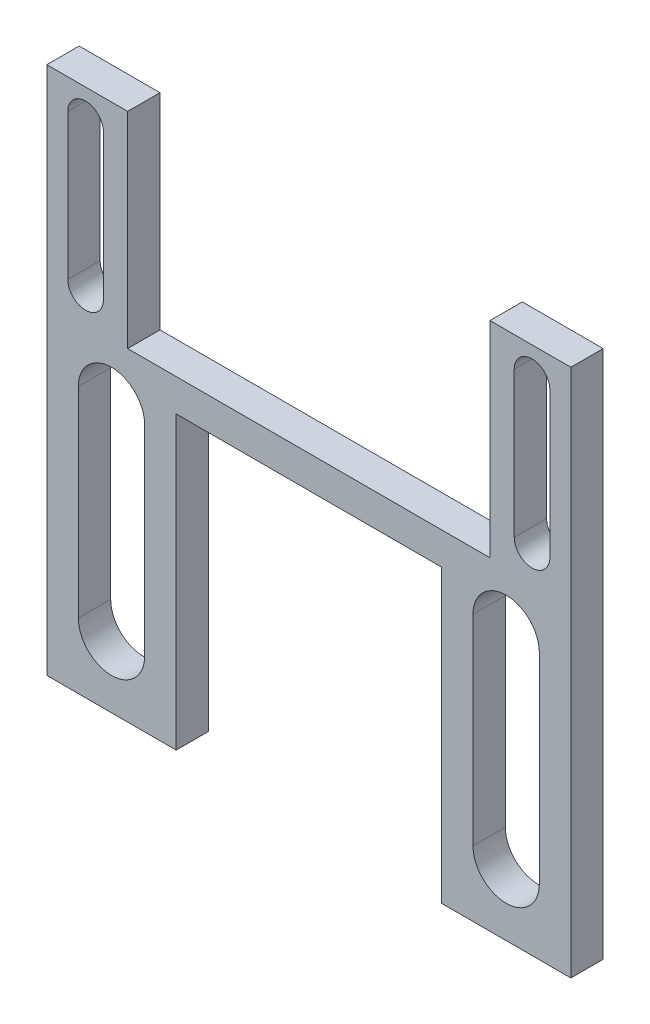
ISO-10303-21;
HEADER;
FILE_DESCRIPTION(('STEP AP214'),'2;1');
FILE_NAME('part.step','',(''),(''),'','','');
FILE_SCHEMA(('AUTOMOTIVE_DESIGN { 1 0 10303 214 1 1 1 1 }'));
ENDSEC;
DATA;
#1=APPLICATION_CONTEXT('core data for automotive mechanical design processes');
#2=APPLICATION_PROTOCOL_DEFINITION('international standard','automotive_design',2000,#1);
#3=PRODUCT_CONTEXT('',#1,'mechanical');
#4=PRODUCT('Part','Part','',(#3));
#5=PRODUCT_RELATED_PRODUCT_CATEGORY('part','',(#4));
#6=PRODUCT_DEFINITION_FORMATION('','',#4);
#7=PRODUCT_DEFINITION_CONTEXT('part definition',#1,'design');
#8=PRODUCT_DEFINITION('design','',#6,#7);
#9=PRODUCT_DEFINITION_SHAPE('','',#8);
#10=(LENGTH_UNIT() NAMED_UNIT(*) SI_UNIT(.MILLI.,.METRE.));
#11=(NAMED_UNIT(*) PLANE_ANGLE_UNIT() SI_UNIT($,.RADIAN.));
#12=(NAMED_UNIT(*) SI_UNIT($,.STERADIAN.) SOLID_ANGLE_UNIT());
#13=UNCERTAINTY_MEASURE_WITH_UNIT(LENGTH_MEASURE(1.E-05),#10,'distance_accuracy_value','');
#14=(GEOMETRIC_REPRESENTATION_CONTEXT(3) GLOBAL_UNCERTAINTY_ASSIGNED_CONTEXT((#13)) GLOBAL_UNIT_ASSIGNED_CONTEXT((#10,
#11,#12)) REPRESENTATION_CONTEXT('',''));
#15=CARTESIAN_POINT('',(0.,0.,0.));
#16=DIRECTION('',(0.,0.,1.));
#17=DIRECTION('',(1.,0.,0.));
#18=AXIS2_PLACEMENT_3D('',#15,#16,#17);
#19=CARTESIAN_POINT('',(27.4,0.,20.2));
#20=DIRECTION('',(0.,0.,1.));
#21=DIRECTION('',(1.,0.,0.));
#22=AXIS2_PLACEMENT_3D('',#19,#20,#21);
#23=PLANE('',#22);
#24=DIRECTION('',(0.,-1.,0.));
#25=VECTOR('',#24,1.);
#26=CARTESIAN_POINT('',(1.95,0.,20.2));
#27=LINE('',#26,#25);
#28=CARTESIAN_POINT('',(1.95,-3.55000000000001,20.2));
#29=VERTEX_POINT('',#28);
#30=CARTESIAN_POINT('',(1.95,-15.95,20.2));
#31=VERTEX_POINT('',#30);
#32=EDGE_CURVE('E1303',#29,#31,#27,.T.);
#33=ORIENTED_EDGE('',*,*,#32,.F.);
#34=CARTESIAN_POINT('',(4.,-3.55000000000001,20.2));
#35=DIRECTION('',(0.,0.,1.));
#36=DIRECTION('',(1.,0.,0.));
#37=AXIS2_PLACEMENT_3D('',#34,#35,#36);
#38=CIRCLE('',#37,2.05000000000001);
#39=CARTESIAN_POINT('',(6.05000000000001,-3.55000000000001,20.2));
#40=VERTEX_POINT('',#39);
#41=EDGE_CURVE('E1284',#40,#29,#38,.T.);
#42=ORIENTED_EDGE('',*,*,#41,.F.);
#43=DIRECTION('',(0.,-1.,0.));
#44=VECTOR('',#43,1.);
#45=CARTESIAN_POINT('',(6.05000000000001,0.,20.2));
#46=LINE('',#45,#44);
#47=CARTESIAN_POINT('',(6.05,-15.95,20.2));
#48=VERTEX_POINT('',#47);
#49=EDGE_CURVE('E1293',#40,#48,#46,.T.);
#50=ORIENTED_EDGE('',*,*,#49,.T.);
#51=CARTESIAN_POINT('',(4.,-15.95,20.2));
#52=DIRECTION('',(0.,0.,1.));
#53=DIRECTION('',(1.,0.,0.));
#54=AXIS2_PLACEMENT_3D('',#51,#52,#53);
#55=CIRCLE('',#54,2.05);
#56=EDGE_CURVE('E1300',#31,#48,#55,.T.);
#57=ORIENTED_EDGE('',*,*,#56,.F.);
#58=EDGE_LOOP('',(#33,#42,#50,#57));
#59=FACE_BOUND('',#58,.T.);
#60=DIRECTION('',(0.,-1.,0.));
#61=VECTOR('',#60,1.);
#62=CARTESIAN_POINT('',(32.4,0.,20.2));
#63=LINE('',#62,#61);
#64=CARTESIAN_POINT('',(32.4,-2.,20.2));
#65=VERTEX_POINT('',#64);
#66=CARTESIAN_POINT('',(32.4,-20.,20.2));
#67=VERTEX_POINT('',#66);
#68=EDGE_CURVE('E1331',#65,#67,#63,.T.);
#69=ORIENTED_EDGE('',*,*,#68,.F.);
#70=CARTESIAN_POINT('',(32.4,-2.,20.2));
#71=DIRECTION('',(0.,1.,0.));
#72=VECTOR('',#71,1.);
#73=LINE('',#70,#72);
#74=CARTESIAN_POINT('',(32.4,5.8,20.2));
#75=VERTEX_POINT('',#74);
#76=EDGE_CURVE('E419',#65,#75,#73,.T.);
#77=ORIENTED_EDGE('',*,*,#76,.T.);
#78=DIRECTION('',(0.,-1.,0.));
#79=VECTOR('',#78,1.);
#80=CARTESIAN_POINT('',(32.4,0.,20.2));
#81=LINE('',#80,#79);
#82=CARTESIAN_POINT('',(32.4,6.9,20.2));
#83=VERTEX_POINT('',#82);
#84=EDGE_CURVE('E1070',#83,#75,#81,.T.);
#85=ORIENTED_EDGE('',*,*,#84,.F.);
#86=CARTESIAN_POINT('',(32.4,6.9,20.2));
#87=DIRECTION('',(0.,1.,0.));
#88=VECTOR('',#87,1.);
#89=LINE('',#86,#88);
#90=CARTESIAN_POINT('',(32.4,12.7,20.2));
#91=VERTEX_POINT('',#90);
#92=EDGE_CURVE('E646',#83,#91,#89,.T.);
#93=ORIENTED_EDGE('',*,*,#92,.T.);
#94=CARTESIAN_POINT('',(27.4,12.7,20.2));
#95=DIRECTION('',(1.,0.,0.));
#96=VECTOR('',#95,1.);
#97=LINE('',#94,#96);
#98=CARTESIAN_POINT('',(27.4,12.7,20.2));
#99=VERTEX_POINT('',#98);
#100=EDGE_CURVE('E638',#99,#91,#97,.T.);
#101=ORIENTED_EDGE('',*,*,#100,.F.);
#102=CARTESIAN_POINT('',(27.4,0.,20.2));
#103=DIRECTION('',(0.,1.,0.));
#104=VECTOR('',#103,1.);
#105=LINE('',#102,#104);
#106=CARTESIAN_POINT('',(27.4,0.,20.2));
#107=VERTEX_POINT('',#106);
#108=EDGE_CURVE('E635',#107,#99,#105,.T.);
#109=ORIENTED_EDGE('',*,*,#108,.F.);
#110=DIRECTION('',(1.,0.,0.));
#111=VECTOR('',#110,1.);
#112=CARTESIAN_POINT('',(5.,0.,20.2));
#113=LINE('',#112,#111);
#114=CARTESIAN_POINT('',(5.,0.,20.2));
#115=VERTEX_POINT('',#114);
#116=EDGE_CURVE('E307',#115,#107,#113,.T.);
#117=ORIENTED_EDGE('',*,*,#116,.F.);
#118=CARTESIAN_POINT('',(5.,0.,20.2));
#119=DIRECTION('',(0.,1.,0.));
#120=VECTOR('',#119,1.);
#121=LINE('',#118,#120);
#122=CARTESIAN_POINT('',(5.,6.35,20.2));
#123=VERTEX_POINT('',#122);
#124=EDGE_CURVE('E455',#115,#123,#121,.T.);
#125=ORIENTED_EDGE('',*,*,#124,.T.);
#126=CARTESIAN_POINT('',(5.,6.35,20.2));
#127=DIRECTION('',(0.,1.,0.));
#128=VECTOR('',#127,1.);
#129=LINE('',#126,#128);
#130=CARTESIAN_POINT('',(5.,12.7,20.2));
#131=VERTEX_POINT('',#130);
#132=EDGE_CURVE('E528',#123,#131,#129,.T.);
#133=ORIENTED_EDGE('',*,*,#132,.T.);
#134=CARTESIAN_POINT('',(0.,12.7,20.2));
#135=DIRECTION('',(1.,0.,0.));
#136=VECTOR('',#135,1.);
#137=LINE('',#134,#136);
#138=CARTESIAN_POINT('',(0.,12.7,20.2));
#139=VERTEX_POINT('',#138);
#140=EDGE_CURVE('E461',#139,#131,#137,.T.);
#141=ORIENTED_EDGE('',*,*,#140,.F.);
#142=CARTESIAN_POINT('',(0.,12.7,20.2));
#143=DIRECTION('',(0.,-1.,0.));
#144=VECTOR('',#143,1.);
#145=LINE('',#142,#144);
#146=CARTESIAN_POINT('',(0.,6.9,20.2));
#147=VERTEX_POINT('',#146);
#148=EDGE_CURVE('E458',#139,#147,#145,.T.);
#149=ORIENTED_EDGE('',*,*,#148,.T.);
#150=DIRECTION('',(0.,-1.,0.));
#151=VECTOR('',#150,1.);
#152=CARTESIAN_POINT('',(0.,0.,20.2));
#153=LINE('',#152,#151);
#154=CARTESIAN_POINT('',(0.,5.8,20.2));
#155=VERTEX_POINT('',#154);
#156=EDGE_CURVE('E434',#147,#155,#153,.T.);
#157=ORIENTED_EDGE('',*,*,#156,.T.);
#158=CARTESIAN_POINT('',(0.,5.8,20.2));
#159=DIRECTION('',(0.,-1.,0.));
#160=VECTOR('',#159,1.);
#161=LINE('',#158,#160);
#162=CARTESIAN_POINT('',(0.,-2.,20.2));
#163=VERTEX_POINT('',#162);
#164=EDGE_CURVE('E449',#155,#163,#161,.T.);
#165=ORIENTED_EDGE('',*,*,#164,.T.);
#166=DIRECTION('',(0.,-1.,0.));
#167=VECTOR('',#166,1.);
#168=CARTESIAN_POINT('',(0.,0.,20.2));
#169=LINE('',#168,#167);
#170=CARTESIAN_POINT('',(0.,-20.,20.2));
#171=VERTEX_POINT('',#170);
#172=EDGE_CURVE('E452',#163,#171,#169,.T.);
#173=ORIENTED_EDGE('',*,*,#172,.T.);
#174=DIRECTION('',(1.,0.,0.));
#175=VECTOR('',#174,1.);
#176=CARTESIAN_POINT('',(0.,-20.,20.2));
#177=LINE('',#176,#175);
#178=CARTESIAN_POINT('',(8.,-20.,20.2));
#179=VERTEX_POINT('',#178);
#180=EDGE_CURVE('E1307',#171,#179,#177,.T.);
#181=ORIENTED_EDGE('',*,*,#180,.T.);
#182=DIRECTION('',(0.,-1.,0.));
#183=VECTOR('',#182,1.);
#184=CARTESIAN_POINT('',(8.,0.,20.2));
#185=LINE('',#184,#183);
#186=CARTESIAN_POINT('',(8.,-2.,20.2));
#187=VERTEX_POINT('',#186);
#188=EDGE_CURVE('E67',#187,#179,#185,.T.);
#189=ORIENTED_EDGE('',*,*,#188,.F.);
#190=DIRECTION('',(1.,0.,0.));
#191=VECTOR('',#190,1.);
#192=CARTESIAN_POINT('',(0.,-2.,20.2));
#193=LINE('',#192,#191);
#194=CARTESIAN_POINT('',(24.4,-2.,20.2));
#195=VERTEX_POINT('',#194);
#196=EDGE_CURVE('E473',#187,#195,#193,.T.);
#197=ORIENTED_EDGE('',*,*,#196,.T.);
#198=DIRECTION('',(0.,-1.,0.));
#199=VECTOR('',#198,1.);
#200=CARTESIAN_POINT('',(24.4,0.,20.2));
#201=LINE('',#200,#199);
#202=CARTESIAN_POINT('',(24.4,-20.,20.2));
#203=VERTEX_POINT('',#202);
#204=EDGE_CURVE('E1407',#195,#203,#201,.T.);
#205=ORIENTED_EDGE('',*,*,#204,.T.);
#206=DIRECTION('',(-1.,0.,0.));
#207=VECTOR('',#206,1.);
#208=CARTESIAN_POINT('',(0.,-20.,20.2));
#209=LINE('',#208,#207);
#210=EDGE_CURVE('E1334',#67,#203,#209,.T.);
#211=ORIENTED_EDGE('',*,*,#210,.F.);
#212=EDGE_LOOP('',(#69,#77,#85,#93,#101,#109,#117,#125,#133,#141,#149,#157,#165,#173,#181,#189,
#197,#205,#211));
#213=FACE_BOUND('',#212,.T.);
#214=CARTESIAN_POINT('',(30.,10.85,20.2));
#215=DIRECTION('',(0.,0.,-1.));
#216=DIRECTION('',(-1.,0.,0.));
#217=AXIS2_PLACEMENT_3D('',#214,#215,#216);
#218=CIRCLE('',#217,1.1);
#219=CARTESIAN_POINT('',(28.9,10.85,20.2));
#220=VERTEX_POINT('',#219);
#221=CARTESIAN_POINT('',(31.1,10.85,20.2));
#222=VERTEX_POINT('',#221);
#223=EDGE_CURVE('E1215',#220,#222,#218,.T.);
#224=ORIENTED_EDGE('',*,*,#223,.T.);
#225=DIRECTION('',(0.,-1.,0.));
#226=VECTOR('',#225,1.);
#227=CARTESIAN_POINT('',(31.1,10.85,20.2));
#228=LINE('',#227,#226);
#229=CARTESIAN_POINT('',(31.1,1.85,20.2));
#230=VERTEX_POINT('',#229);
#231=EDGE_CURVE('E1211',#222,#230,#228,.T.);
#232=ORIENTED_EDGE('',*,*,#231,.T.);
#233=CARTESIAN_POINT('',(30.,1.85,20.2));
#234=DIRECTION('',(0.,0.,-1.));
#235=DIRECTION('',(-1.,0.,0.));
#236=AXIS2_PLACEMENT_3D('',#233,#234,#235);
#237=CIRCLE('',#236,1.1);
#238=CARTESIAN_POINT('',(28.9,1.85,20.2));
#239=VERTEX_POINT('',#238);
#240=EDGE_CURVE('E1216',#230,#239,#237,.T.);
#241=ORIENTED_EDGE('',*,*,#240,.T.);
#242=DIRECTION('',(0.,-1.,0.));
#243=VECTOR('',#242,1.);
#244=CARTESIAN_POINT('',(28.9,10.85,20.2));
#245=LINE('',#244,#243);
#246=EDGE_CURVE('E1221',#220,#239,#245,.T.);
#247=ORIENTED_EDGE('',*,*,#246,.F.);
#248=EDGE_LOOP('',(#224,#232,#241,#247));
#249=FACE_BOUND('',#248,.T.);
#250=CARTESIAN_POINT('',(2.4,1.85,20.2));
#251=DIRECTION('',(0.,0.,-1.));
#252=DIRECTION('',(-1.,0.,0.));
#253=AXIS2_PLACEMENT_3D('',#250,#251,#252);
#254=CIRCLE('',#253,1.1);
#255=CARTESIAN_POINT('',(1.3,1.85,20.2));
#256=VERTEX_POINT('',#255);
#257=CARTESIAN_POINT('',(3.5,1.85,20.2));
#258=VERTEX_POINT('',#257);
#259=EDGE_CURVE('E1202',#256,#258,#254,.F.);
#260=ORIENTED_EDGE('',*,*,#259,.F.);
#261=DIRECTION('',(0.,-1.,0.));
#262=VECTOR('',#261,1.);
#263=CARTESIAN_POINT('',(1.3,0.,20.2));
#264=LINE('',#263,#262);
#265=CARTESIAN_POINT('',(1.3,10.85,20.2));
#266=VERTEX_POINT('',#265);
#267=EDGE_CURVE('E1204',#266,#256,#264,.T.);
#268=ORIENTED_EDGE('',*,*,#267,.F.);
#269=CARTESIAN_POINT('',(2.4,10.85,20.2));
#270=DIRECTION('',(0.,0.,-1.));
#271=DIRECTION('',(-1.,0.,0.));
#272=AXIS2_PLACEMENT_3D('',#269,#270,#271);
#273=CIRCLE('',#272,1.1);
#274=CARTESIAN_POINT('',(3.5,10.85,20.2));
#275=VERTEX_POINT('',#274);
#276=EDGE_CURVE('E1208',#275,#266,#273,.F.);
#277=ORIENTED_EDGE('',*,*,#276,.F.);
#278=DIRECTION('',(0.,-1.,0.));
#279=VECTOR('',#278,1.);
#280=CARTESIAN_POINT('',(3.5,0.,20.2));
#281=LINE('',#280,#279);
#282=EDGE_CURVE('E1244',#275,#258,#281,.T.);
#283=ORIENTED_EDGE('',*,*,#282,.T.);
#284=EDGE_LOOP('',(#260,#268,#277,#283));
#285=FACE_BOUND('',#284,.T.);
#286=CARTESIAN_POINT('',(28.4,-3.55000000000001,20.2));
#287=DIRECTION('',(0.,0.,1.));
#288=DIRECTION('',(1.,0.,0.));
#289=AXIS2_PLACEMENT_3D('',#286,#287,#288);
#290=CIRCLE('',#289,2.05000000000001);
#291=CARTESIAN_POINT('',(26.35,-3.55000000000001,20.2));
#292=VERTEX_POINT('',#291);
#293=CARTESIAN_POINT('',(30.45,-3.55000000000001,20.2));
#294=VERTEX_POINT('',#293);
#295=EDGE_CURVE('E1405',#292,#294,#290,.F.);
#296=ORIENTED_EDGE('',*,*,#295,.T.);
#297=DIRECTION('',(0.,-1.,0.));
#298=VECTOR('',#297,1.);
#299=CARTESIAN_POINT('',(30.45,0.,20.2));
#300=LINE('',#299,#298);
#301=CARTESIAN_POINT('',(30.45,-15.95,20.2));
#302=VERTEX_POINT('',#301);
#303=EDGE_CURVE('E1378',#294,#302,#300,.T.);
#304=ORIENTED_EDGE('',*,*,#303,.T.);
#305=CARTESIAN_POINT('',(28.4,-15.95,20.2));
#306=DIRECTION('',(0.,0.,1.));
#307=DIRECTION('',(1.,0.,0.));
#308=AXIS2_PLACEMENT_3D('',#305,#306,#307);
#309=CIRCLE('',#308,2.05);
#310=CARTESIAN_POINT('',(26.35,-15.95,20.2));
#311=VERTEX_POINT('',#310);
#312=EDGE_CURVE('E1399',#302,#311,#309,.F.);
#313=ORIENTED_EDGE('',*,*,#312,.T.);
#314=DIRECTION('',(0.,-1.,0.));
#315=VECTOR('',#314,1.);
#316=CARTESIAN_POINT('',(26.35,0.,20.2));
#317=LINE('',#316,#315);
#318=EDGE_CURVE('E1402',#292,#311,#317,.T.);
#319=ORIENTED_EDGE('',*,*,#318,.F.);
#320=EDGE_LOOP('',(#296,#304,#313,#319));
#321=FACE_BOUND('',#320,.T.);
#322=ADVANCED_FACE('F47',(#59,#213,#249,#285,#321),#23,.T.);
#323=CARTESIAN_POINT('',(27.4,0.,18.2));
#324=DIRECTION('',(0.,0.,1.));
#325=DIRECTION('',(1.,0.,0.));
#326=AXIS2_PLACEMENT_3D('',#323,#324,#325);
#327=PLANE('',#326);
#328=CARTESIAN_POINT('',(2.4,10.85,18.2));
#329=DIRECTION('',(0.,0.,-1.));
#330=DIRECTION('',(-1.,0.,0.));
#331=AXIS2_PLACEMENT_3D('',#328,#329,#330);
#332=CIRCLE('',#331,1.1);
#333=CARTESIAN_POINT('',(3.5,10.85,18.2));
#334=VERTEX_POINT('',#333);
#335=CARTESIAN_POINT('',(1.3,10.85,18.2));
#336=VERTEX_POINT('',#335);
#337=EDGE_CURVE('E1252',#334,#336,#332,.F.);
#338=ORIENTED_EDGE('',*,*,#337,.T.);
#339=DIRECTION('',(0.,1.,0.));
#340=VECTOR('',#339,1.);
#341=CARTESIAN_POINT('',(1.3,0.,18.2));
#342=LINE('',#341,#340);
#343=CARTESIAN_POINT('',(1.3,1.85,18.2));
#344=VERTEX_POINT('',#343);
#345=EDGE_CURVE('E11',#344,#336,#342,.T.);
#346=ORIENTED_EDGE('',*,*,#345,.F.);
#347=CARTESIAN_POINT('',(2.4,1.85,18.2));
#348=DIRECTION('',(0.,0.,-1.));
#349=DIRECTION('',(-1.,0.,0.));
#350=AXIS2_PLACEMENT_3D('',#347,#348,#349);
#351=CIRCLE('',#350,1.1);
#352=CARTESIAN_POINT('',(3.5,1.85,18.2));
#353=VERTEX_POINT('',#352);
#354=EDGE_CURVE('E1226',#344,#353,#351,.F.);
#355=ORIENTED_EDGE('',*,*,#354,.T.);
#356=DIRECTION('',(0.,-1.,0.));
#357=VECTOR('',#356,1.);
#358=CARTESIAN_POINT('',(3.5,0.,18.2));
#359=LINE('',#358,#357);
#360=EDGE_CURVE('E1205',#334,#353,#359,.T.);
#361=ORIENTED_EDGE('',*,*,#360,.F.);
#362=EDGE_LOOP('',(#338,#346,#355,#361));
#363=FACE_BOUND('',#362,.T.);
#364=CARTESIAN_POINT('',(4.,-3.55000000000001,18.2));
#365=DIRECTION('',(0.,0.,1.));
#366=DIRECTION('',(1.,0.,0.));
#367=AXIS2_PLACEMENT_3D('',#364,#365,#366);
#368=CIRCLE('',#367,2.05000000000001);
#369=CARTESIAN_POINT('',(6.05000000000001,-3.55000000000001,18.2));
#370=VERTEX_POINT('',#369);
#371=CARTESIAN_POINT('',(1.95,-3.55000000000001,18.2));
#372=VERTEX_POINT('',#371);
#373=EDGE_CURVE('E1273',#370,#372,#368,.T.);
#374=ORIENTED_EDGE('',*,*,#373,.T.);
#375=DIRECTION('',(0.,-1.,0.));
#376=VECTOR('',#375,1.);
#377=CARTESIAN_POINT('',(1.95,0.,18.2));
#378=LINE('',#377,#376);
#379=CARTESIAN_POINT('',(1.95,-15.95,18.2));
#380=VERTEX_POINT('',#379);
#381=EDGE_CURVE('E290',#372,#380,#378,.T.);
#382=ORIENTED_EDGE('',*,*,#381,.T.);
#383=CARTESIAN_POINT('',(4.,-15.95,18.2));
#384=DIRECTION('',(0.,0.,1.));
#385=DIRECTION('',(1.,0.,0.));
#386=AXIS2_PLACEMENT_3D('',#383,#384,#385);
#387=CIRCLE('',#386,2.05);
#388=CARTESIAN_POINT('',(6.05,-15.95,18.2));
#389=VERTEX_POINT('',#388);
#390=EDGE_CURVE('E1291',#380,#389,#387,.T.);
#391=ORIENTED_EDGE('',*,*,#390,.T.);
#392=DIRECTION('',(0.,-1.,0.));
#393=VECTOR('',#392,1.);
#394=CARTESIAN_POINT('',(6.05000000000001,0.,18.2));
#395=LINE('',#394,#393);
#396=EDGE_CURVE('E1278',#370,#389,#395,.T.);
#397=ORIENTED_EDGE('',*,*,#396,.F.);
#398=EDGE_LOOP('',(#374,#382,#391,#397));
#399=FACE_BOUND('',#398,.T.);
#400=DIRECTION('',(0.,-1.,0.));
#401=VECTOR('',#400,1.);
#402=CARTESIAN_POINT('',(32.4,0.,18.2));
#403=LINE('',#402,#401);
#404=CARTESIAN_POINT('',(32.4,6.9,18.2));
#405=VERTEX_POINT('',#404);
#406=CARTESIAN_POINT('',(32.4,5.8,18.2));
#407=VERTEX_POINT('',#406);
#408=EDGE_CURVE('E442',#405,#407,#403,.T.);
#409=ORIENTED_EDGE('',*,*,#408,.T.);
#410=CARTESIAN_POINT('',(32.4,0.,18.2));
#411=DIRECTION('',(0.,1.,0.));
#412=VECTOR('',#411,1.);
#413=LINE('',#410,#412);
#414=CARTESIAN_POINT('',(32.4,0.,18.2));
#415=VERTEX_POINT('',#414);
#416=EDGE_CURVE('E297',#415,#407,#413,.T.);
#417=ORIENTED_EDGE('',*,*,#416,.F.);
#418=DIRECTION('',(0.,-1.,0.));
#419=VECTOR('',#418,1.);
#420=CARTESIAN_POINT('',(32.4,0.,18.2));
#421=LINE('',#420,#419);
#422=CARTESIAN_POINT('',(32.4,-20.,18.2));
#423=VERTEX_POINT('',#422);
#424=EDGE_CURVE('E1192',#415,#423,#421,.T.);
#425=ORIENTED_EDGE('',*,*,#424,.T.);
#426=DIRECTION('',(-1.,0.,0.));
#427=VECTOR('',#426,1.);
#428=CARTESIAN_POINT('',(0.,-20.,18.2));
#429=LINE('',#428,#427);
#430=CARTESIAN_POINT('',(24.4,-20.,18.2));
#431=VERTEX_POINT('',#430);
#432=EDGE_CURVE('E1339',#423,#431,#429,.T.);
#433=ORIENTED_EDGE('',*,*,#432,.T.);
#434=DIRECTION('',(0.,-1.,0.));
#435=VECTOR('',#434,1.);
#436=CARTESIAN_POINT('',(24.4,0.,18.2));
#437=LINE('',#436,#435);
#438=CARTESIAN_POINT('',(24.4,-2.,18.2));
#439=VERTEX_POINT('',#438);
#440=EDGE_CURVE('E1390',#439,#431,#437,.T.);
#441=ORIENTED_EDGE('',*,*,#440,.F.);
#442=DIRECTION('',(1.,0.,0.));
#443=VECTOR('',#442,1.);
#444=CARTESIAN_POINT('',(0.,-2.,18.2));
#445=LINE('',#444,#443);
#446=CARTESIAN_POINT('',(8.,-2.,18.2));
#447=VERTEX_POINT('',#446);
#448=EDGE_CURVE('E1376',#447,#439,#445,.T.);
#449=ORIENTED_EDGE('',*,*,#448,.F.);
#450=DIRECTION('',(0.,-1.,0.));
#451=VECTOR('',#450,1.);
#452=CARTESIAN_POINT('',(8.,0.,18.2));
#453=LINE('',#452,#451);
#454=CARTESIAN_POINT('',(8.,-20.,18.2));
#455=VERTEX_POINT('',#454);
#456=EDGE_CURVE('E1279',#447,#455,#453,.T.);
#457=ORIENTED_EDGE('',*,*,#456,.T.);
#458=DIRECTION('',(1.,0.,0.));
#459=VECTOR('',#458,1.);
#460=CARTESIAN_POINT('',(0.,-20.,18.2));
#461=LINE('',#460,#459);
#462=CARTESIAN_POINT('',(0.,-20.,18.2));
#463=VERTEX_POINT('',#462);
#464=EDGE_CURVE('E288',#463,#455,#461,.T.);
#465=ORIENTED_EDGE('',*,*,#464,.F.);
#466=DIRECTION('',(0.,-1.,0.));
#467=VECTOR('',#466,1.);
#468=CARTESIAN_POINT('',(0.,0.,18.2));
#469=LINE('',#468,#467);
#470=CARTESIAN_POINT('',(0.,0.,18.2));
#471=VERTEX_POINT('',#470);
#472=EDGE_CURVE('E280',#471,#463,#469,.T.);
#473=ORIENTED_EDGE('',*,*,#472,.F.);
#474=CARTESIAN_POINT('',(0.,5.8,18.2));
#475=DIRECTION('',(0.,-1.,0.));
#476=VECTOR('',#475,1.);
#477=LINE('',#474,#476);
#478=CARTESIAN_POINT('',(0.,5.8,18.2));
#479=VERTEX_POINT('',#478);
#480=EDGE_CURVE('E284',#479,#471,#477,.T.);
#481=ORIENTED_EDGE('',*,*,#480,.F.);
#482=DIRECTION('',(0.,-1.,0.));
#483=VECTOR('',#482,1.);
#484=CARTESIAN_POINT('',(0.,0.,18.2));
#485=LINE('',#484,#483);
#486=CARTESIAN_POINT('',(0.,6.9,18.2));
#487=VERTEX_POINT('',#486);
#488=EDGE_CURVE('E294',#487,#479,#485,.T.);
#489=ORIENTED_EDGE('',*,*,#488,.F.);
#490=CARTESIAN_POINT('',(0.,12.7,18.2));
#491=DIRECTION('',(0.,-1.,0.));
#492=VECTOR('',#491,1.);
#493=LINE('',#490,#492);
#494=CARTESIAN_POINT('',(0.,12.7,18.2));
#495=VERTEX_POINT('',#494);
#496=EDGE_CURVE('E557',#495,#487,#493,.T.);
#497=ORIENTED_EDGE('',*,*,#496,.F.);
#498=CARTESIAN_POINT('',(0.,12.7,18.2));
#499=DIRECTION('',(1.,0.,0.));
#500=VECTOR('',#499,1.);
#501=LINE('',#498,#500);
#502=CARTESIAN_POINT('',(5.,12.7,18.2));
#503=VERTEX_POINT('',#502);
#504=EDGE_CURVE('E546',#495,#503,#501,.T.);
#505=ORIENTED_EDGE('',*,*,#504,.T.);
#506=CARTESIAN_POINT('',(5.,6.35,18.2));
#507=DIRECTION('',(0.,1.,0.));
#508=VECTOR('',#507,1.);
#509=LINE('',#506,#508);
#510=CARTESIAN_POINT('',(5.,6.35,18.2));
#511=VERTEX_POINT('',#510);
#512=EDGE_CURVE('E558',#511,#503,#509,.T.);
#513=ORIENTED_EDGE('',*,*,#512,.F.);
#514=CARTESIAN_POINT('',(5.,0.,18.2));
#515=DIRECTION('',(0.,1.,0.));
#516=VECTOR('',#515,1.);
#517=LINE('',#514,#516);
#518=CARTESIAN_POINT('',(5.,0.,18.2));
#519=VERTEX_POINT('',#518);
#520=EDGE_CURVE('E296',#519,#511,#517,.T.);
#521=ORIENTED_EDGE('',*,*,#520,.F.);
#522=DIRECTION('',(1.,0.,0.));
#523=VECTOR('',#522,1.);
#524=CARTESIAN_POINT('',(0.,0.,18.2));
#525=LINE('',#524,#523);
#526=CARTESIAN_POINT('',(27.4,0.,18.2));
#527=VERTEX_POINT('',#526);
#528=EDGE_CURVE('E1375',#519,#527,#525,.T.);
#529=ORIENTED_EDGE('',*,*,#528,.T.);
#530=CARTESIAN_POINT('',(27.4,0.,18.2));
#531=DIRECTION('',(0.,1.,0.));
#532=VECTOR('',#531,1.);
#533=LINE('',#530,#532);
#534=CARTESIAN_POINT('',(27.4,12.7,18.2));
#535=VERTEX_POINT('',#534);
#536=EDGE_CURVE('E584',#527,#535,#533,.T.);
#537=ORIENTED_EDGE('',*,*,#536,.T.);
#538=CARTESIAN_POINT('',(27.4,12.7,18.2));
#539=DIRECTION('',(1.,0.,0.));
#540=VECTOR('',#539,1.);
#541=LINE('',#538,#540);
#542=CARTESIAN_POINT('',(32.4,12.7,18.2));
#543=VERTEX_POINT('',#542);
#544=EDGE_CURVE('E592',#535,#543,#541,.T.);
#545=ORIENTED_EDGE('',*,*,#544,.T.);
#546=CARTESIAN_POINT('',(32.4,6.9,18.2));
#547=DIRECTION('',(0.,1.,0.));
#548=VECTOR('',#547,1.);
#549=LINE('',#546,#548);
#550=EDGE_CURVE('E600',#405,#543,#549,.T.);
#551=ORIENTED_EDGE('',*,*,#550,.F.);
#552=EDGE_LOOP('',(#409,#417,#425,#433,#441,#449,#457,#465,#473,#481,#489,#497,#505,#513,#521,
#529,#537,#545,#551));
#553=FACE_BOUND('',#552,.T.);
#554=DIRECTION('',(0.,1.,0.));
#555=VECTOR('',#554,1.);
#556=CARTESIAN_POINT('',(31.1,0.,18.2));
#557=LINE('',#556,#555);
#558=CARTESIAN_POINT('',(31.1,1.85,18.2));
#559=VERTEX_POINT('',#558);
#560=CARTESIAN_POINT('',(31.1,10.85,18.2));
#561=VERTEX_POINT('',#560);
#562=EDGE_CURVE('E59',#559,#561,#557,.T.);
#563=ORIENTED_EDGE('',*,*,#562,.T.);
#564=CARTESIAN_POINT('',(30.,10.85,18.2));
#565=DIRECTION('',(0.,0.,-1.));
#566=DIRECTION('',(-1.,0.,0.));
#567=AXIS2_PLACEMENT_3D('',#564,#565,#566);
#568=CIRCLE('',#567,1.1);
#569=CARTESIAN_POINT('',(28.9,10.85,18.2));
#570=VERTEX_POINT('',#569);
#571=EDGE_CURVE('E1224',#570,#561,#568,.T.);
#572=ORIENTED_EDGE('',*,*,#571,.F.);
#573=DIRECTION('',(0.,-1.,0.));
#574=VECTOR('',#573,1.);
#575=CARTESIAN_POINT('',(28.9,10.85,18.2));
#576=LINE('',#575,#574);
#577=CARTESIAN_POINT('',(28.9,1.85,18.2));
#578=VERTEX_POINT('',#577);
#579=EDGE_CURVE('E1230',#570,#578,#576,.T.);
#580=ORIENTED_EDGE('',*,*,#579,.T.);
#581=CARTESIAN_POINT('',(30.,1.85,18.2));
#582=DIRECTION('',(0.,0.,-1.));
#583=DIRECTION('',(-1.,0.,0.));
#584=AXIS2_PLACEMENT_3D('',#581,#582,#583);
#585=CIRCLE('',#584,1.1);
#586=EDGE_CURVE('E1227',#559,#578,#585,.T.);
#587=ORIENTED_EDGE('',*,*,#586,.F.);
#588=EDGE_LOOP('',(#563,#572,#580,#587));
#589=FACE_BOUND('',#588,.T.);
#590=CARTESIAN_POINT('',(28.4,-3.55000000000001,18.2));
#591=DIRECTION('',(0.,0.,1.));
#592=DIRECTION('',(1.,0.,0.));
#593=AXIS2_PLACEMENT_3D('',#590,#591,#592);
#594=CIRCLE('',#593,2.05000000000001);
#595=CARTESIAN_POINT('',(26.35,-3.55000000000001,18.2));
#596=VERTEX_POINT('',#595);
#597=CARTESIAN_POINT('',(30.45,-3.55000000000001,18.2));
#598=VERTEX_POINT('',#597);
#599=EDGE_CURVE('E1338',#596,#598,#594,.F.);
#600=ORIENTED_EDGE('',*,*,#599,.F.);
#601=DIRECTION('',(0.,-1.,0.));
#602=VECTOR('',#601,1.);
#603=CARTESIAN_POINT('',(26.35,0.,18.2));
#604=LINE('',#603,#602);
#605=CARTESIAN_POINT('',(26.35,-15.95,18.2));
#606=VERTEX_POINT('',#605);
#607=EDGE_CURVE('E1388',#596,#606,#604,.T.);
#608=ORIENTED_EDGE('',*,*,#607,.T.);
#609=CARTESIAN_POINT('',(28.4,-15.95,18.2));
#610=DIRECTION('',(0.,0.,1.));
#611=DIRECTION('',(1.,0.,0.));
#612=AXIS2_PLACEMENT_3D('',#609,#610,#611);
#613=CIRCLE('',#612,2.05);
#614=CARTESIAN_POINT('',(30.45,-15.95,18.2));
#615=VERTEX_POINT('',#614);
#616=EDGE_CURVE('E1385',#615,#606,#613,.F.);
#617=ORIENTED_EDGE('',*,*,#616,.F.);
#618=DIRECTION('',(0.,-1.,0.));
#619=VECTOR('',#618,1.);
#620=CARTESIAN_POINT('',(30.45,0.,18.2));
#621=LINE('',#620,#619);
#622=EDGE_CURVE('E1333',#598,#615,#621,.T.);
#623=ORIENTED_EDGE('',*,*,#622,.F.);
#624=EDGE_LOOP('',(#600,#608,#617,#623));
#625=FACE_BOUND('',#624,.T.);
#626=ADVANCED_FACE('F282',(#363,#399,#553,#589,#625),#327,.F.);
#627=CARTESIAN_POINT('',(0.,-2.,0.));
#628=DIRECTION('',(0.,1.,0.));
#629=DIRECTION('',(1.,0.,0.));
#630=AXIS2_PLACEMENT_3D('',#627,#628,#629);
#631=PLANE('',#630);
#632=DIRECTION('',(0.,0.,1.));
#633=VECTOR('',#632,1.);
#634=CARTESIAN_POINT('',(8.,-2.,18.2));
#635=LINE('',#634,#633);
#636=EDGE_CURVE('E1316',#447,#187,#635,.T.);
#637=ORIENTED_EDGE('',*,*,#636,.F.);
#638=ORIENTED_EDGE('',*,*,#448,.T.);
#639=DIRECTION('',(0.,0.,1.));
#640=VECTOR('',#639,1.);
#641=CARTESIAN_POINT('',(24.4,-2.,18.2));
#642=LINE('',#641,#640);
#643=EDGE_CURVE('E1419',#439,#195,#642,.T.);
#644=ORIENTED_EDGE('',*,*,#643,.T.);
#645=ORIENTED_EDGE('',*,*,#196,.F.);
#646=EDGE_LOOP('',(#637,#638,#644,#645));
#647=FACE_BOUND('',#646,.T.);
#648=ADVANCED_FACE('F485',(#647),#631,.F.);
#649=CARTESIAN_POINT('',(27.4,12.7,20.2));
#650=DIRECTION('',(-1.,0.,0.));
#651=DIRECTION('',(0.,-1.,0.));
#652=AXIS2_PLACEMENT_3D('',#649,#650,#651);
#653=PLANE('',#652);
#654=ORIENTED_EDGE('',*,*,#536,.F.);
#655=CARTESIAN_POINT('',(27.4,0.,20.2));
#656=DIRECTION('',(0.,0.,-1.));
#657=VECTOR('',#656,1.);
#658=LINE('',#655,#657);
#659=EDGE_CURVE('E616',#107,#527,#658,.T.);
#660=ORIENTED_EDGE('',*,*,#659,.F.);
#661=ORIENTED_EDGE('',*,*,#108,.T.);
#662=CARTESIAN_POINT('',(27.4,12.7,18.2));
#663=DIRECTION('',(0.,0.,1.));
#664=VECTOR('',#663,1.);
#665=LINE('',#662,#664);
#666=EDGE_CURVE('E1076',#535,#99,#665,.T.);
#667=ORIENTED_EDGE('',*,*,#666,.F.);
#668=EDGE_LOOP('',(#654,#660,#661,#667));
#669=FACE_BOUND('',#668,.T.);
#670=ADVANCED_FACE('F367',(#669),#653,.T.);
#671=CARTESIAN_POINT('',(32.4,6.9,20.2));
#672=DIRECTION('',(1.,0.,0.));
#673=DIRECTION('',(0.,1.,0.));
#674=AXIS2_PLACEMENT_3D('',#671,#672,#673);
#675=PLANE('',#674);
#676=ORIENTED_EDGE('',*,*,#424,.F.);
#677=ORIENTED_EDGE('',*,*,#416,.T.);
#678=ORIENTED_EDGE('',*,*,#408,.F.);
#679=ORIENTED_EDGE('',*,*,#550,.T.);
#680=CARTESIAN_POINT('',(32.4,12.7,18.2));
#681=DIRECTION('',(0.,0.,1.));
#682=VECTOR('',#681,1.);
#683=LINE('',#680,#682);
#684=EDGE_CURVE('E412',#543,#91,#683,.T.);
#685=ORIENTED_EDGE('',*,*,#684,.T.);
#686=ORIENTED_EDGE('',*,*,#92,.F.);
#687=ORIENTED_EDGE('',*,*,#84,.T.);
#688=ORIENTED_EDGE('',*,*,#76,.F.);
#689=ORIENTED_EDGE('',*,*,#68,.T.);
#690=DIRECTION('',(0.,0.,1.));
#691=VECTOR('',#690,1.);
#692=CARTESIAN_POINT('',(32.4,-20.,18.2));
#693=LINE('',#692,#691);
#694=EDGE_CURVE('E1414',#423,#67,#693,.T.);
#695=ORIENTED_EDGE('',*,*,#694,.F.);
#696=EDGE_LOOP('',(#676,#677,#678,#679,#685,#686,#687,#688,#689,#695));
#697=FACE_BOUND('',#696,.T.);
#698=ADVANCED_FACE('F49',(#697),#675,.T.);
#699=CARTESIAN_POINT('',(32.4,12.7,20.2));
#700=DIRECTION('',(0.,1.,0.));
#701=DIRECTION('',(-1.,0.,0.));
#702=AXIS2_PLACEMENT_3D('',#699,#700,#701);
#703=PLANE('',#702);
#704=ORIENTED_EDGE('',*,*,#684,.F.);
#705=ORIENTED_EDGE('',*,*,#544,.F.);
#706=ORIENTED_EDGE('',*,*,#666,.T.);
#707=ORIENTED_EDGE('',*,*,#100,.T.);
#708=EDGE_LOOP('',(#704,#705,#706,#707));
#709=FACE_BOUND('',#708,.T.);
#710=ADVANCED_FACE('F366',(#709),#703,.T.);
#711=CARTESIAN_POINT('',(5.,6.35,20.2));
#712=DIRECTION('',(1.,0.,0.));
#713=DIRECTION('',(0.,1.,0.));
#714=AXIS2_PLACEMENT_3D('',#711,#712,#713);
#715=PLANE('',#714);
#716=ORIENTED_EDGE('',*,*,#132,.F.);
#717=ORIENTED_EDGE('',*,*,#124,.F.);
#718=CARTESIAN_POINT('',(5.,0.,18.2));
#719=DIRECTION('',(0.,0.,1.));
#720=VECTOR('',#719,1.);
#721=LINE('',#718,#720);
#722=EDGE_CURVE('E608',#519,#115,#721,.T.);
#723=ORIENTED_EDGE('',*,*,#722,.F.);
#724=ORIENTED_EDGE('',*,*,#520,.T.);
#725=ORIENTED_EDGE('',*,*,#512,.T.);
#726=CARTESIAN_POINT('',(5.,12.7,18.2));
#727=DIRECTION('',(0.,0.,1.));
#728=VECTOR('',#727,1.);
#729=LINE('',#726,#728);
#730=EDGE_CURVE('E351',#503,#131,#729,.T.);
#731=ORIENTED_EDGE('',*,*,#730,.T.);
#732=EDGE_LOOP('',(#716,#717,#723,#724,#725,#731));
#733=FACE_BOUND('',#732,.T.);
#734=ADVANCED_FACE('F357',(#733),#715,.T.);
#735=CARTESIAN_POINT('',(5.,12.7,20.2));
#736=DIRECTION('',(0.,1.,0.));
#737=DIRECTION('',(-1.,0.,0.));
#738=AXIS2_PLACEMENT_3D('',#735,#736,#737);
#739=PLANE('',#738);
#740=ORIENTED_EDGE('',*,*,#730,.F.);
#741=ORIENTED_EDGE('',*,*,#504,.F.);
#742=CARTESIAN_POINT('',(0.,12.7,18.2));
#743=DIRECTION('',(0.,0.,1.));
#744=VECTOR('',#743,1.);
#745=LINE('',#742,#744);
#746=EDGE_CURVE('E464',#495,#139,#745,.T.);
#747=ORIENTED_EDGE('',*,*,#746,.T.);
#748=ORIENTED_EDGE('',*,*,#140,.T.);
#749=EDGE_LOOP('',(#740,#741,#747,#748));
#750=FACE_BOUND('',#749,.T.);
#751=ADVANCED_FACE('F318',(#750),#739,.T.);
#752=CARTESIAN_POINT('',(0.,12.7,20.2));
#753=DIRECTION('',(-1.,0.,0.));
#754=DIRECTION('',(0.,-1.,0.));
#755=AXIS2_PLACEMENT_3D('',#752,#753,#754);
#756=PLANE('',#755);
#757=ORIENTED_EDGE('',*,*,#480,.T.);
#758=ORIENTED_EDGE('',*,*,#472,.T.);
#759=DIRECTION('',(0.,0.,1.));
#760=VECTOR('',#759,1.);
#761=CARTESIAN_POINT('',(0.,-20.,18.2));
#762=LINE('',#761,#760);
#763=EDGE_CURVE('E1286',#463,#171,#762,.T.);
#764=ORIENTED_EDGE('',*,*,#763,.T.);
#765=ORIENTED_EDGE('',*,*,#172,.F.);
#766=ORIENTED_EDGE('',*,*,#164,.F.);
#767=ORIENTED_EDGE('',*,*,#156,.F.);
#768=ORIENTED_EDGE('',*,*,#148,.F.);
#769=ORIENTED_EDGE('',*,*,#746,.F.);
#770=ORIENTED_EDGE('',*,*,#496,.T.);
#771=ORIENTED_EDGE('',*,*,#488,.T.);
#772=EDGE_LOOP('',(#757,#758,#764,#765,#766,#767,#768,#769,#770,#771));
#773=FACE_BOUND('',#772,.T.);
#774=ADVANCED_FACE('F293',(#773),#756,.T.);
#775=CARTESIAN_POINT('',(0.,0.,0.));
#776=DIRECTION('',(0.,1.,0.));
#777=DIRECTION('',(1.,0.,0.));
#778=AXIS2_PLACEMENT_3D('',#775,#776,#777);
#779=PLANE('',#778);
#780=ORIENTED_EDGE('',*,*,#528,.F.);
#781=ORIENTED_EDGE('',*,*,#722,.T.);
#782=ORIENTED_EDGE('',*,*,#116,.T.);
#783=ORIENTED_EDGE('',*,*,#659,.T.);
#784=EDGE_LOOP('',(#780,#781,#782,#783));
#785=FACE_BOUND('',#784,.T.);
#786=ADVANCED_FACE('F317',(#785),#779,.T.);
#787=CARTESIAN_POINT('',(31.1,10.85,20.2));
#788=DIRECTION('',(1.,0.,0.));
#789=DIRECTION('',(0.,0.,-1.));
#790=AXIS2_PLACEMENT_3D('',#787,#788,#789);
#791=PLANE('',#790);
#792=ORIENTED_EDGE('',*,*,#231,.F.);
#793=DIRECTION('',(0.,0.,-1.));
#794=VECTOR('',#793,1.);
#795=CARTESIAN_POINT('',(31.1,10.85,20.2));
#796=LINE('',#795,#794);
#797=EDGE_CURVE('E1223',#222,#561,#796,.T.);
#798=ORIENTED_EDGE('',*,*,#797,.T.);
#799=ORIENTED_EDGE('',*,*,#562,.F.);
#800=DIRECTION('',(0.,0.,-1.));
#801=VECTOR('',#800,1.);
#802=CARTESIAN_POINT('',(31.1,1.85,20.2));
#803=LINE('',#802,#801);
#804=EDGE_CURVE('E1236',#230,#559,#803,.T.);
#805=ORIENTED_EDGE('',*,*,#804,.F.);
#806=EDGE_LOOP('',(#792,#798,#799,#805));
#807=FACE_BOUND('',#806,.T.);
#808=ADVANCED_FACE('F798',(#807),#791,.F.);
#809=CARTESIAN_POINT('',(30.,10.85,20.2));
#810=DIRECTION('',(0.,0.,-1.));
#811=DIRECTION('',(-1.,0.,0.));
#812=AXIS2_PLACEMENT_3D('',#809,#810,#811);
#813=CYLINDRICAL_SURFACE('',#812,1.1);
#814=ORIENTED_EDGE('',*,*,#571,.T.);
#815=ORIENTED_EDGE('',*,*,#797,.F.);
#816=ORIENTED_EDGE('',*,*,#223,.F.);
#817=DIRECTION('',(0.,0.,-1.));
#818=VECTOR('',#817,1.);
#819=CARTESIAN_POINT('',(28.9,10.85,20.2));
#820=LINE('',#819,#818);
#821=EDGE_CURVE('E1195',#220,#570,#820,.T.);
#822=ORIENTED_EDGE('',*,*,#821,.T.);
#823=EDGE_LOOP('',(#814,#815,#816,#822));
#824=FACE_BOUND('',#823,.T.);
#825=ADVANCED_FACE('F883',(#824),#813,.F.);
#826=CARTESIAN_POINT('',(28.9,10.85,20.2));
#827=DIRECTION('',(1.,0.,0.));
#828=DIRECTION('',(0.,0.,-1.));
#829=AXIS2_PLACEMENT_3D('',#826,#827,#828);
#830=PLANE('',#829);
#831=ORIENTED_EDGE('',*,*,#579,.F.);
#832=ORIENTED_EDGE('',*,*,#821,.F.);
#833=ORIENTED_EDGE('',*,*,#246,.T.);
#834=DIRECTION('',(0.,0.,-1.));
#835=VECTOR('',#834,1.);
#836=CARTESIAN_POINT('',(28.9,1.85,20.2));
#837=LINE('',#836,#835);
#838=EDGE_CURVE('E1234',#239,#578,#837,.T.);
#839=ORIENTED_EDGE('',*,*,#838,.T.);
#840=EDGE_LOOP('',(#831,#832,#833,#839));
#841=FACE_BOUND('',#840,.T.);
#842=ADVANCED_FACE('F923',(#841),#830,.T.);
#843=CARTESIAN_POINT('',(30.,1.85,20.2));
#844=DIRECTION('',(0.,0.,-1.));
#845=DIRECTION('',(-1.,0.,0.));
#846=AXIS2_PLACEMENT_3D('',#843,#844,#845);
#847=CYLINDRICAL_SURFACE('',#846,1.1);
#848=ORIENTED_EDGE('',*,*,#586,.T.);
#849=ORIENTED_EDGE('',*,*,#838,.F.);
#850=ORIENTED_EDGE('',*,*,#240,.F.);
#851=ORIENTED_EDGE('',*,*,#804,.T.);
#852=EDGE_LOOP('',(#848,#849,#850,#851));
#853=FACE_BOUND('',#852,.T.);
#854=ADVANCED_FACE('F871',(#853),#847,.F.);
#855=CARTESIAN_POINT('',(1.3,0.,20.2));
#856=DIRECTION('',(1.,0.,0.));
#857=DIRECTION('',(0.,0.,-1.));
#858=AXIS2_PLACEMENT_3D('',#855,#856,#857);
#859=PLANE('',#858);
#860=ORIENTED_EDGE('',*,*,#345,.T.);
#861=DIRECTION('',(0.,0.,-1.));
#862=VECTOR('',#861,1.);
#863=CARTESIAN_POINT('',(1.3,10.85,20.2));
#864=LINE('',#863,#862);
#865=EDGE_CURVE('E1243',#266,#336,#864,.T.);
#866=ORIENTED_EDGE('',*,*,#865,.F.);
#867=ORIENTED_EDGE('',*,*,#267,.T.);
#868=DIRECTION('',(0.,0.,-1.));
#869=VECTOR('',#868,1.);
#870=CARTESIAN_POINT('',(1.3,1.85,20.2));
#871=LINE('',#870,#869);
#872=EDGE_CURVE('E1241',#256,#344,#871,.T.);
#873=ORIENTED_EDGE('',*,*,#872,.T.);
#874=EDGE_LOOP('',(#860,#866,#867,#873));
#875=FACE_BOUND('',#874,.T.);
#876=ADVANCED_FACE('F866',(#875),#859,.T.);
#877=CARTESIAN_POINT('',(2.4,1.85,20.2));
#878=DIRECTION('',(0.,0.,-1.));
#879=DIRECTION('',(-1.,0.,0.));
#880=AXIS2_PLACEMENT_3D('',#877,#878,#879);
#881=CYLINDRICAL_SURFACE('',#880,1.1);
#882=ORIENTED_EDGE('',*,*,#354,.F.);
#883=ORIENTED_EDGE('',*,*,#872,.F.);
#884=ORIENTED_EDGE('',*,*,#259,.T.);
#885=DIRECTION('',(0.,0.,-1.));
#886=VECTOR('',#885,1.);
#887=CARTESIAN_POINT('',(3.5,1.85,20.2));
#888=LINE('',#887,#886);
#889=EDGE_CURVE('E630',#258,#353,#888,.T.);
#890=ORIENTED_EDGE('',*,*,#889,.T.);
#891=EDGE_LOOP('',(#882,#883,#884,#890));
#892=FACE_BOUND('',#891,.T.);
#893=ADVANCED_FACE('F870',(#892),#881,.F.);
#894=CARTESIAN_POINT('',(3.5,0.,20.2));
#895=DIRECTION('',(1.,0.,0.));
#896=DIRECTION('',(0.,0.,-1.));
#897=AXIS2_PLACEMENT_3D('',#894,#895,#896);
#898=PLANE('',#897);
#899=ORIENTED_EDGE('',*,*,#360,.T.);
#900=ORIENTED_EDGE('',*,*,#889,.F.);
#901=ORIENTED_EDGE('',*,*,#282,.F.);
#902=DIRECTION('',(0.,0.,-1.));
#903=VECTOR('',#902,1.);
#904=CARTESIAN_POINT('',(3.5,10.85,20.2));
#905=LINE('',#904,#903);
#906=EDGE_CURVE('E1247',#275,#334,#905,.T.);
#907=ORIENTED_EDGE('',*,*,#906,.T.);
#908=EDGE_LOOP('',(#899,#900,#901,#907));
#909=FACE_BOUND('',#908,.T.);
#910=ADVANCED_FACE('F895',(#909),#898,.F.);
#911=CARTESIAN_POINT('',(2.4,10.85,20.2));
#912=DIRECTION('',(0.,0.,-1.));
#913=DIRECTION('',(-1.,0.,0.));
#914=AXIS2_PLACEMENT_3D('',#911,#912,#913);
#915=CYLINDRICAL_SURFACE('',#914,1.1);
#916=ORIENTED_EDGE('',*,*,#337,.F.);
#917=ORIENTED_EDGE('',*,*,#906,.F.);
#918=ORIENTED_EDGE('',*,*,#276,.T.);
#919=ORIENTED_EDGE('',*,*,#865,.T.);
#920=EDGE_LOOP('',(#916,#917,#918,#919));
#921=FACE_BOUND('',#920,.T.);
#922=ADVANCED_FACE('F860',(#921),#915,.F.);
#923=CARTESIAN_POINT('',(4.,-15.95,18.2));
#924=DIRECTION('',(0.,0.,1.));
#925=DIRECTION('',(1.,0.,0.));
#926=AXIS2_PLACEMENT_3D('',#923,#924,#925);
#927=CYLINDRICAL_SURFACE('',#926,2.05);
#928=ORIENTED_EDGE('',*,*,#56,.T.);
#929=DIRECTION('',(0.,0.,1.));
#930=VECTOR('',#929,1.);
#931=CARTESIAN_POINT('',(6.05,-15.95,18.2));
#932=LINE('',#931,#930);
#933=EDGE_CURVE('E1312',#389,#48,#932,.T.);
#934=ORIENTED_EDGE('',*,*,#933,.F.);
#935=ORIENTED_EDGE('',*,*,#390,.F.);
#936=DIRECTION('',(0.,0.,1.));
#937=VECTOR('',#936,1.);
#938=CARTESIAN_POINT('',(1.95,-15.95,18.2));
#939=LINE('',#938,#937);
#940=EDGE_CURVE('E1287',#380,#31,#939,.T.);
#941=ORIENTED_EDGE('',*,*,#940,.T.);
#942=EDGE_LOOP('',(#928,#934,#935,#941));
#943=FACE_BOUND('',#942,.T.);
#944=ADVANCED_FACE('F853',(#943),#927,.F.);
#945=CARTESIAN_POINT('',(6.05000000000001,0.,18.2));
#946=DIRECTION('',(-1.,0.,0.));
#947=DIRECTION('',(0.,-1.,0.));
#948=AXIS2_PLACEMENT_3D('',#945,#946,#947);
#949=PLANE('',#948);
#950=ORIENTED_EDGE('',*,*,#49,.F.);
#951=DIRECTION('',(0.,0.,1.));
#952=VECTOR('',#951,1.);
#953=CARTESIAN_POINT('',(6.05000000000001,-3.55000000000001,18.2));
#954=LINE('',#953,#952);
#955=EDGE_CURVE('E1314',#370,#40,#954,.T.);
#956=ORIENTED_EDGE('',*,*,#955,.F.);
#957=ORIENTED_EDGE('',*,*,#396,.T.);
#958=ORIENTED_EDGE('',*,*,#933,.T.);
#959=EDGE_LOOP('',(#950,#956,#957,#958));
#960=FACE_BOUND('',#959,.T.);
#961=ADVANCED_FACE('F714',(#960),#949,.T.);
#962=CARTESIAN_POINT('',(4.,-3.55000000000001,18.2));
#963=DIRECTION('',(0.,0.,1.));
#964=DIRECTION('',(1.,0.,0.));
#965=AXIS2_PLACEMENT_3D('',#962,#963,#964);
#966=CYLINDRICAL_SURFACE('',#965,2.05000000000001);
#967=ORIENTED_EDGE('',*,*,#41,.T.);
#968=DIRECTION('',(0.,0.,1.));
#969=VECTOR('',#968,1.);
#970=CARTESIAN_POINT('',(1.95,-3.55000000000001,18.2));
#971=LINE('',#970,#969);
#972=EDGE_CURVE('E1282',#372,#29,#971,.T.);
#973=ORIENTED_EDGE('',*,*,#972,.F.);
#974=ORIENTED_EDGE('',*,*,#373,.F.);
#975=ORIENTED_EDGE('',*,*,#955,.T.);
#976=EDGE_LOOP('',(#967,#973,#974,#975));
#977=FACE_BOUND('',#976,.T.);
#978=ADVANCED_FACE('F708',(#977),#966,.F.);
#979=CARTESIAN_POINT('',(8.,0.,18.2));
#980=DIRECTION('',(-1.,0.,0.));
#981=DIRECTION('',(0.,-1.,0.));
#982=AXIS2_PLACEMENT_3D('',#979,#980,#981);
#983=PLANE('',#982);
#984=ORIENTED_EDGE('',*,*,#188,.T.);
#985=DIRECTION('',(0.,0.,1.));
#986=VECTOR('',#985,1.);
#987=CARTESIAN_POINT('',(8.,-20.,18.2));
#988=LINE('',#987,#986);
#989=EDGE_CURVE('E1318',#455,#179,#988,.T.);
#990=ORIENTED_EDGE('',*,*,#989,.F.);
#991=ORIENTED_EDGE('',*,*,#456,.F.);
#992=ORIENTED_EDGE('',*,*,#636,.T.);
#993=EDGE_LOOP('',(#984,#990,#991,#992));
#994=FACE_BOUND('',#993,.T.);
#995=ADVANCED_FACE('F713',(#994),#983,.F.);
#996=CARTESIAN_POINT('',(0.,-20.,18.2));
#997=DIRECTION('',(0.,-1.,0.));
#998=DIRECTION('',(0.,0.,-1.));
#999=AXIS2_PLACEMENT_3D('',#996,#997,#998);
#1000=PLANE('',#999);
#1001=ORIENTED_EDGE('',*,*,#180,.F.);
#1002=ORIENTED_EDGE('',*,*,#763,.F.);
#1003=ORIENTED_EDGE('',*,*,#464,.T.);
#1004=ORIENTED_EDGE('',*,*,#989,.T.);
#1005=EDGE_LOOP('',(#1001,#1002,#1003,#1004));
#1006=FACE_BOUND('',#1005,.T.);
#1007=ADVANCED_FACE('F805',(#1006),#1000,.T.);
#1008=CARTESIAN_POINT('',(1.95,0.,18.2));
#1009=DIRECTION('',(-1.,0.,0.));
#1010=DIRECTION('',(0.,-1.,0.));
#1011=AXIS2_PLACEMENT_3D('',#1008,#1009,#1010);
#1012=PLANE('',#1011);
#1013=ORIENTED_EDGE('',*,*,#32,.T.);
#1014=ORIENTED_EDGE('',*,*,#940,.F.);
#1015=ORIENTED_EDGE('',*,*,#381,.F.);
#1016=ORIENTED_EDGE('',*,*,#972,.T.);
#1017=EDGE_LOOP('',(#1013,#1014,#1015,#1016));
#1018=FACE_BOUND('',#1017,.T.);
#1019=ADVANCED_FACE('F816',(#1018),#1012,.F.);
#1020=CARTESIAN_POINT('',(30.45,0.,18.2));
#1021=DIRECTION('',(-1.,0.,0.));
#1022=DIRECTION('',(0.,-1.,0.));
#1023=AXIS2_PLACEMENT_3D('',#1020,#1021,#1022);
#1024=PLANE('',#1023);
#1025=ORIENTED_EDGE('',*,*,#303,.F.);
#1026=DIRECTION('',(0.,0.,1.));
#1027=VECTOR('',#1026,1.);
#1028=CARTESIAN_POINT('',(30.45,-3.55000000000001,18.2));
#1029=LINE('',#1028,#1027);
#1030=EDGE_CURVE('E1304',#598,#294,#1029,.T.);
#1031=ORIENTED_EDGE('',*,*,#1030,.F.);
#1032=ORIENTED_EDGE('',*,*,#622,.T.);
#1033=DIRECTION('',(0.,0.,1.));
#1034=VECTOR('',#1033,1.);
#1035=CARTESIAN_POINT('',(30.45,-15.95,18.2));
#1036=LINE('',#1035,#1034);
#1037=EDGE_CURVE('E1393',#615,#302,#1036,.T.);
#1038=ORIENTED_EDGE('',*,*,#1037,.T.);
#1039=EDGE_LOOP('',(#1025,#1031,#1032,#1038));
#1040=FACE_BOUND('',#1039,.T.);
#1041=ADVANCED_FACE('F728',(#1040),#1024,.T.);
#1042=CARTESIAN_POINT('',(28.4,-3.55000000000001,18.2));
#1043=DIRECTION('',(0.,0.,1.));
#1044=DIRECTION('',(1.,0.,0.));
#1045=AXIS2_PLACEMENT_3D('',#1042,#1043,#1044);
#1046=CYLINDRICAL_SURFACE('',#1045,2.05000000000001);
#1047=ORIENTED_EDGE('',*,*,#1030,.T.);
#1048=ORIENTED_EDGE('',*,*,#295,.F.);
#1049=DIRECTION('',(0.,0.,1.));
#1050=VECTOR('',#1049,1.);
#1051=CARTESIAN_POINT('',(26.35,-3.55000000000001,18.2));
#1052=LINE('',#1051,#1050);
#1053=EDGE_CURVE('E1422',#596,#292,#1052,.T.);
#1054=ORIENTED_EDGE('',*,*,#1053,.F.);
#1055=ORIENTED_EDGE('',*,*,#599,.T.);
#1056=EDGE_LOOP('',(#1047,#1048,#1054,#1055));
#1057=FACE_BOUND('',#1056,.T.);
#1058=ADVANCED_FACE('F724',(#1057),#1046,.F.);
#1059=CARTESIAN_POINT('',(0.,-20.,18.2));
#1060=DIRECTION('',(0.,1.,0.));
#1061=DIRECTION('',(0.,0.,1.));
#1062=AXIS2_PLACEMENT_3D('',#1059,#1060,#1061);
#1063=PLANE('',#1062);
#1064=ORIENTED_EDGE('',*,*,#210,.T.);
#1065=DIRECTION('',(0.,0.,1.));
#1066=VECTOR('',#1065,1.);
#1067=CARTESIAN_POINT('',(24.4,-20.,18.2));
#1068=LINE('',#1067,#1066);
#1069=EDGE_CURVE('E1417',#431,#203,#1068,.T.);
#1070=ORIENTED_EDGE('',*,*,#1069,.F.);
#1071=ORIENTED_EDGE('',*,*,#432,.F.);
#1072=ORIENTED_EDGE('',*,*,#694,.T.);
#1073=EDGE_LOOP('',(#1064,#1070,#1071,#1072));
#1074=FACE_BOUND('',#1073,.T.);
#1075=ADVANCED_FACE('F727',(#1074),#1063,.F.);
#1076=CARTESIAN_POINT('',(24.4,0.,18.2));
#1077=DIRECTION('',(-1.,0.,0.));
#1078=DIRECTION('',(0.,0.,1.));
#1079=AXIS2_PLACEMENT_3D('',#1076,#1077,#1078);
#1080=PLANE('',#1079);
#1081=ORIENTED_EDGE('',*,*,#204,.F.);
#1082=ORIENTED_EDGE('',*,*,#643,.F.);
#1083=ORIENTED_EDGE('',*,*,#440,.T.);
#1084=ORIENTED_EDGE('',*,*,#1069,.T.);
#1085=EDGE_LOOP('',(#1081,#1082,#1083,#1084));
#1086=FACE_BOUND('',#1085,.T.);
#1087=ADVANCED_FACE('F699',(#1086),#1080,.T.);
#1088=CARTESIAN_POINT('',(26.35,0.,18.2));
#1089=DIRECTION('',(-1.,0.,0.));
#1090=DIRECTION('',(0.,-1.,0.));
#1091=AXIS2_PLACEMENT_3D('',#1088,#1089,#1090);
#1092=PLANE('',#1091);
#1093=ORIENTED_EDGE('',*,*,#318,.T.);
#1094=DIRECTION('',(0.,0.,1.));
#1095=VECTOR('',#1094,1.);
#1096=CARTESIAN_POINT('',(26.35,-15.95,18.2));
#1097=LINE('',#1096,#1095);
#1098=EDGE_CURVE('E1424',#606,#311,#1097,.T.);
#1099=ORIENTED_EDGE('',*,*,#1098,.F.);
#1100=ORIENTED_EDGE('',*,*,#607,.F.);
#1101=ORIENTED_EDGE('',*,*,#1053,.T.);
#1102=EDGE_LOOP('',(#1093,#1099,#1100,#1101));
#1103=FACE_BOUND('',#1102,.T.);
#1104=ADVANCED_FACE('F748',(#1103),#1092,.F.);
#1105=CARTESIAN_POINT('',(28.4,-15.95,18.2));
#1106=DIRECTION('',(0.,0.,1.));
#1107=DIRECTION('',(1.,0.,0.));
#1108=AXIS2_PLACEMENT_3D('',#1105,#1106,#1107);
#1109=CYLINDRICAL_SURFACE('',#1108,2.05);
#1110=ORIENTED_EDGE('',*,*,#312,.F.);
#1111=ORIENTED_EDGE('',*,*,#1037,.F.);
#1112=ORIENTED_EDGE('',*,*,#616,.T.);
#1113=ORIENTED_EDGE('',*,*,#1098,.T.);
#1114=EDGE_LOOP('',(#1110,#1111,#1112,#1113));
#1115=FACE_BOUND('',#1114,.T.);
#1116=ADVANCED_FACE('F753',(#1115),#1109,.F.);
#1117=CLOSED_SHELL('',(#322,#626,#648,#670,#698,#710,#734,#751,#774,#786,#808,#825,#842,#854,
#876,#893,#910,#922,#944,#961,#978,#995,#1007,#1019,#1041,#1058,#1075,#1087,#1104,#1116));
#1118=MANIFOLD_SOLID_BREP('B2',#1117);
#1119=ADVANCED_BREP_SHAPE_REPRESENTATION('',(#18,#1118),#14);
#1120=SHAPE_DEFINITION_REPRESENTATION(#9,#1119);
ENDSEC;
END-ISO-10303-21;
